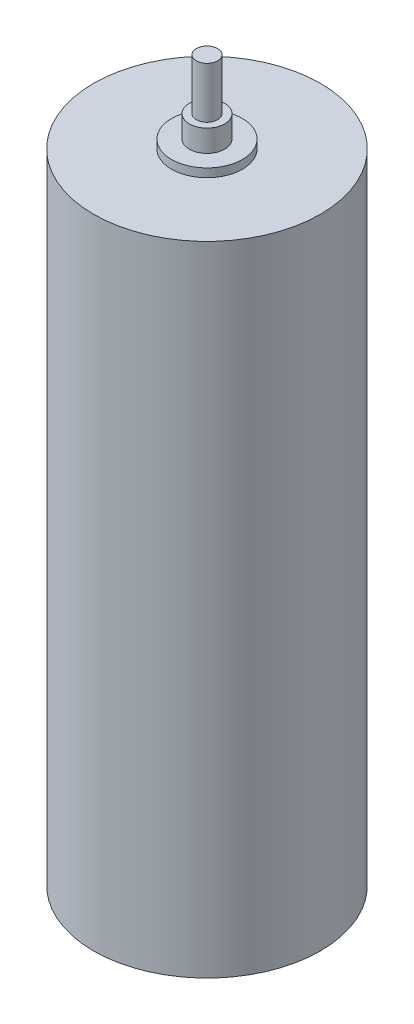
ISO-10303-21;
HEADER;
FILE_DESCRIPTION(('STEP AP214'),'2;1');
FILE_NAME('part.step','',(''),(''),'','','');
FILE_SCHEMA(('AUTOMOTIVE_DESIGN { 1 0 10303 214 1 1 1 1 }'));
ENDSEC;
DATA;
#1=APPLICATION_CONTEXT('core data for automotive mechanical design processes');
#2=APPLICATION_PROTOCOL_DEFINITION('international standard','automotive_design',2000,#1);
#3=PRODUCT_CONTEXT('',#1,'mechanical');
#4=PRODUCT('Part','Part','',(#3));
#5=PRODUCT_RELATED_PRODUCT_CATEGORY('part','',(#4));
#6=PRODUCT_DEFINITION_FORMATION('','',#4);
#7=PRODUCT_DEFINITION_CONTEXT('part definition',#1,'design');
#8=PRODUCT_DEFINITION('design','',#6,#7);
#9=PRODUCT_DEFINITION_SHAPE('','',#8);
#10=(LENGTH_UNIT() NAMED_UNIT(*) SI_UNIT(.MILLI.,.METRE.));
#11=(NAMED_UNIT(*) PLANE_ANGLE_UNIT() SI_UNIT($,.RADIAN.));
#12=(NAMED_UNIT(*) SI_UNIT($,.STERADIAN.) SOLID_ANGLE_UNIT());
#13=UNCERTAINTY_MEASURE_WITH_UNIT(LENGTH_MEASURE(1.E-05),#10,'distance_accuracy_value','');
#14=(GEOMETRIC_REPRESENTATION_CONTEXT(3) GLOBAL_UNCERTAINTY_ASSIGNED_CONTEXT((#13)) GLOBAL_UNIT_ASSIGNED_CONTEXT((#10,
#11,#12)) REPRESENTATION_CONTEXT('',''));
#15=CARTESIAN_POINT('',(0.,0.,0.));
#16=DIRECTION('',(0.,0.,1.));
#17=DIRECTION('',(1.,0.,0.));
#18=AXIS2_PLACEMENT_3D('',#15,#16,#17);
#19=CARTESIAN_POINT('',(0.,-45.,0.));
#20=DIRECTION('',(0.,1.,0.));
#21=DIRECTION('',(0.,0.,1.));
#22=AXIS2_PLACEMENT_3D('',#19,#20,#21);
#23=CYLINDRICAL_SURFACE('',#22,8.);
#24=CARTESIAN_POINT('',(0.,-45.,0.));
#25=DIRECTION('',(0.,1.,0.));
#26=DIRECTION('',(0.,0.,1.));
#27=AXIS2_PLACEMENT_3D('',#24,#25,#26);
#28=CIRCLE('',#27,8.);
#29=CARTESIAN_POINT('',(0.,-45.,8.));
#30=VERTEX_POINT('',#29);
#31=EDGE_CURVE('E41',#30,#30,#28,.T.);
#32=CARTESIAN_POINT('',(0.,0.,0.));
#33=DIRECTION('',(0.,1.,0.));
#34=DIRECTION('',(0.,0.,1.));
#35=AXIS2_PLACEMENT_3D('',#32,#33,#34);
#36=CIRCLE('',#35,8.);
#37=CARTESIAN_POINT('',(0.,0.,8.));
#38=VERTEX_POINT('',#37);
#39=EDGE_CURVE('E46',#38,#38,#36,.T.);
#40=CARTESIAN_POINT('',(0.,-45.,8.));
#41=CARTESIAN_POINT('',(0.,-44.53125,8.));
#42=CARTESIAN_POINT('',(0.,-44.0625,8.));
#43=CARTESIAN_POINT('',(0.,-43.125,8.));
#44=CARTESIAN_POINT('',(0.,-42.65625,8.));
#45=CARTESIAN_POINT('',(0.,-41.71875,8.));
#46=CARTESIAN_POINT('',(0.,-41.25,8.));
#47=CARTESIAN_POINT('',(0.,-40.3125,8.));
#48=CARTESIAN_POINT('',(0.,-39.84375,8.));
#49=CARTESIAN_POINT('',(0.,-38.90625,8.));
#50=CARTESIAN_POINT('',(0.,-38.4375,8.));
#51=CARTESIAN_POINT('',(0.,-37.5,8.));
#52=CARTESIAN_POINT('',(0.,-37.03125,8.));
#53=CARTESIAN_POINT('',(0.,-36.09375,8.));
#54=CARTESIAN_POINT('',(0.,-35.625,8.));
#55=CARTESIAN_POINT('',(0.,-34.6875,8.));
#56=CARTESIAN_POINT('',(0.,-34.21875,8.));
#57=CARTESIAN_POINT('',(0.,-33.28125,8.));
#58=CARTESIAN_POINT('',(0.,-32.8125,8.));
#59=CARTESIAN_POINT('',(0.,-31.875,8.));
#60=CARTESIAN_POINT('',(0.,-31.40625,8.));
#61=CARTESIAN_POINT('',(0.,-30.46875,8.));
#62=CARTESIAN_POINT('',(0.,-30.,8.));
#63=CARTESIAN_POINT('',(0.,-29.0625,8.));
#64=CARTESIAN_POINT('',(0.,-28.59375,8.));
#65=CARTESIAN_POINT('',(0.,-27.65625,8.));
#66=CARTESIAN_POINT('',(0.,-27.1875,8.));
#67=CARTESIAN_POINT('',(0.,-26.25,8.));
#68=CARTESIAN_POINT('',(0.,-25.78125,8.));
#69=CARTESIAN_POINT('',(0.,-24.84375,8.));
#70=CARTESIAN_POINT('',(0.,-24.375,8.));
#71=CARTESIAN_POINT('',(0.,-23.4375,8.));
#72=CARTESIAN_POINT('',(0.,-22.96875,8.));
#73=CARTESIAN_POINT('',(0.,-22.03125,8.));
#74=CARTESIAN_POINT('',(0.,-21.5625,8.));
#75=CARTESIAN_POINT('',(0.,-20.625,8.));
#76=CARTESIAN_POINT('',(0.,-20.15625,8.));
#77=CARTESIAN_POINT('',(0.,-19.21875,8.));
#78=CARTESIAN_POINT('',(0.,-18.75,8.));
#79=CARTESIAN_POINT('',(0.,-17.8125,8.));
#80=CARTESIAN_POINT('',(0.,-17.34375,8.));
#81=CARTESIAN_POINT('',(0.,-16.40625,8.));
#82=CARTESIAN_POINT('',(0.,-15.9375,8.));
#83=CARTESIAN_POINT('',(0.,-15.,8.));
#84=CARTESIAN_POINT('',(0.,-14.53125,8.));
#85=CARTESIAN_POINT('',(0.,-13.59375,8.));
#86=CARTESIAN_POINT('',(0.,-13.125,8.));
#87=CARTESIAN_POINT('',(0.,-12.1875,8.));
#88=CARTESIAN_POINT('',(0.,-11.71875,8.));
#89=CARTESIAN_POINT('',(0.,-10.78125,8.));
#90=CARTESIAN_POINT('',(0.,-10.3125,8.));
#91=CARTESIAN_POINT('',(0.,-9.37500000000001,8.));
#92=CARTESIAN_POINT('',(0.,-8.90625000000001,8.));
#93=CARTESIAN_POINT('',(0.,-7.96875000000001,8.));
#94=CARTESIAN_POINT('',(0.,-7.50000000000001,8.));
#95=CARTESIAN_POINT('',(0.,-6.56250000000001,8.));
#96=CARTESIAN_POINT('',(0.,-6.09375000000001,8.));
#97=CARTESIAN_POINT('',(0.,-5.15625000000001,8.));
#98=CARTESIAN_POINT('',(0.,-4.68750000000001,8.));
#99=CARTESIAN_POINT('',(0.,-3.75000000000001,8.));
#100=CARTESIAN_POINT('',(0.,-3.28125000000001,8.));
#101=CARTESIAN_POINT('',(0.,-2.34375000000001,8.));
#102=CARTESIAN_POINT('',(0.,-1.87500000000001,8.));
#103=CARTESIAN_POINT('',(0.,-0.937500000000006,8.));
#104=CARTESIAN_POINT('',(0.,-0.468750000000007,8.));
#105=CARTESIAN_POINT('',(0.,0.,8.));
#106=B_SPLINE_CURVE_WITH_KNOTS('',3,(#40,#41,#42,#43,#44,#45,#46,#47,#48,#49,#50,#51,#52,#53,
#54,#55,#56,#57,#58,#59,#60,#61,#62,#63,#64,#65,#66,#67,#68,#69,#70,#71,#72,#73,#74,#75,#76,#77,
#78,#79,#80,#81,#82,#83,#84,#85,#86,#87,#88,#89,#90,#91,#92,#93,#94,#95,#96,#97,#98,#99,#100,
#101,#102,#103,#104,#105),.UNSPECIFIED.,.F.,.F.,(4,2,2,2,2,2,2,2,2,2,2,2,2,2,2,2,2,2,2,2,2,2,2,
2,2,2,2,2,2,2,2,2,4),(0.,1.40625,2.8125,4.21874999999999,5.625,7.03125,8.43749999999999,9.84375,
11.25,12.65625,14.0625,15.46875,16.875,18.28125,19.6875,21.09375,22.5,23.90625,25.3125,26.71875,
28.125,29.53125,30.9375,32.34375,33.75,35.15625,36.5625,37.96875,39.375,40.78125,42.1875,
43.59375,45.),.UNSPECIFIED.);
#107=EDGE_CURVE('BSEAM34',#30,#38,#106,.T.);
#108=ORIENTED_EDGE('',*,*,#31,.T.);
#109=ORIENTED_EDGE('',*,*,#39,.F.);
#110=ORIENTED_EDGE('',*,*,#107,.T.);
#111=ORIENTED_EDGE('',*,*,#107,.F.);
#112=EDGE_LOOP('',(#108,#110,#109,#111));
#113=FACE_BOUND('',#112,.T.);
#114=ADVANCED_FACE('F34',(#113),#23,.T.);
#115=CARTESIAN_POINT('',(0.,-45.,0.));
#116=DIRECTION('',(0.,1.,0.));
#117=DIRECTION('',(0.,0.,1.));
#118=AXIS2_PLACEMENT_3D('',#115,#116,#117);
#119=PLANE('',#118);
#120=ORIENTED_EDGE('',*,*,#31,.F.);
#121=EDGE_LOOP('',(#120));
#122=FACE_BOUND('',#121,.T.);
#123=ADVANCED_FACE('F83',(#122),#119,.F.);
#124=CARTESIAN_POINT('',(0.,0.,0.));
#125=DIRECTION('',(0.,1.,0.));
#126=DIRECTION('',(0.,0.,1.));
#127=AXIS2_PLACEMENT_3D('',#124,#125,#126);
#128=PLANE('',#127);
#129=CARTESIAN_POINT('',(0.,0.,0.));
#130=DIRECTION('',(0.,1.,0.));
#131=DIRECTION('',(0.,0.,1.));
#132=AXIS2_PLACEMENT_3D('',#129,#130,#131);
#133=CIRCLE('',#132,2.5);
#134=CARTESIAN_POINT('',(0.,0.,2.5));
#135=VERTEX_POINT('',#134);
#136=EDGE_CURVE('E10',#135,#135,#133,.T.);
#137=ORIENTED_EDGE('',*,*,#136,.F.);
#138=EDGE_LOOP('',(#137));
#139=FACE_BOUND('',#138,.T.);
#140=ORIENTED_EDGE('',*,*,#39,.T.);
#141=EDGE_LOOP('',(#140));
#142=FACE_BOUND('',#141,.T.);
#143=ADVANCED_FACE('F74',(#139,#142),#128,.T.);
#144=CARTESIAN_POINT('',(0.,0.6,0.));
#145=DIRECTION('',(0.,-1.,0.));
#146=DIRECTION('',(0.,0.,-1.));
#147=AXIS2_PLACEMENT_3D('',#144,#145,#146);
#148=CYLINDRICAL_SURFACE('',#147,2.5);
#149=CARTESIAN_POINT('',(0.,0.6,0.));
#150=DIRECTION('',(0.,1.,0.));
#151=DIRECTION('',(0.,0.,1.));
#152=AXIS2_PLACEMENT_3D('',#149,#150,#151);
#153=CIRCLE('',#152,2.5);
#154=CARTESIAN_POINT('',(0.,0.6,2.5));
#155=VERTEX_POINT('',#154);
#156=EDGE_CURVE('E49',#155,#155,#153,.T.);
#157=ORIENTED_EDGE('',*,*,#156,.F.);
#158=EDGE_LOOP('',(#157));
#159=FACE_BOUND('',#158,.T.);
#160=ORIENTED_EDGE('',*,*,#136,.T.);
#161=EDGE_LOOP('',(#160));
#162=FACE_BOUND('',#161,.T.);
#163=ADVANCED_FACE('F72',(#159,#162),#148,.T.);
#164=CARTESIAN_POINT('',(0.,0.6,0.));
#165=DIRECTION('',(0.,1.,0.));
#166=DIRECTION('',(0.,0.,1.));
#167=AXIS2_PLACEMENT_3D('',#164,#165,#166);
#168=PLANE('',#167);
#169=CARTESIAN_POINT('',(0.,0.6,0.));
#170=DIRECTION('',(0.,1.,0.));
#171=DIRECTION('',(0.,0.,1.));
#172=AXIS2_PLACEMENT_3D('',#169,#170,#171);
#173=CIRCLE('',#172,1.25);
#174=CARTESIAN_POINT('',(0.,0.6,-1.25));
#175=VERTEX_POINT('',#174);
#176=EDGE_CURVE('E37',#175,#175,#173,.F.);
#177=ORIENTED_EDGE('',*,*,#176,.T.);
#178=EDGE_LOOP('',(#177));
#179=FACE_BOUND('',#178,.T.);
#180=ORIENTED_EDGE('',*,*,#156,.T.);
#181=EDGE_LOOP('',(#180));
#182=FACE_BOUND('',#181,.T.);
#183=ADVANCED_FACE('F70',(#179,#182),#168,.T.);
#184=CARTESIAN_POINT('',(0.,2.15,0.));
#185=DIRECTION('',(0.,-1.,0.));
#186=DIRECTION('',(0.,0.,-1.));
#187=AXIS2_PLACEMENT_3D('',#184,#185,#186);
#188=CYLINDRICAL_SURFACE('',#187,1.25);
#189=CARTESIAN_POINT('',(0.,2.15,0.));
#190=DIRECTION('',(0.,1.,0.));
#191=DIRECTION('',(0.,0.,1.));
#192=AXIS2_PLACEMENT_3D('',#189,#190,#191);
#193=CIRCLE('',#192,1.25);
#194=CARTESIAN_POINT('',(0.,2.15,-1.25));
#195=VERTEX_POINT('',#194);
#196=EDGE_CURVE('E55',#195,#195,#193,.T.);
#197=CARTESIAN_POINT('',(0.,0.6,-1.25));
#198=CARTESIAN_POINT('',(0.,0.616145833333333,-1.25));
#199=CARTESIAN_POINT('',(0.,0.632291666666666,-1.25));
#200=CARTESIAN_POINT('',(0.,0.664583333333333,-1.25));
#201=CARTESIAN_POINT('',(0.,0.680729166666666,-1.25));
#202=CARTESIAN_POINT('',(0.,0.713020833333333,-1.25));
#203=CARTESIAN_POINT('',(0.,0.729166666666666,-1.25));
#204=CARTESIAN_POINT('',(0.,0.761458333333333,-1.25));
#205=CARTESIAN_POINT('',(0.,0.777604166666666,-1.25));
#206=CARTESIAN_POINT('',(0.,0.809895833333333,-1.25));
#207=CARTESIAN_POINT('',(0.,0.826041666666666,-1.25));
#208=CARTESIAN_POINT('',(0.,0.858333333333333,-1.25));
#209=CARTESIAN_POINT('',(0.,0.874479166666666,-1.25));
#210=CARTESIAN_POINT('',(0.,0.906770833333333,-1.25));
#211=CARTESIAN_POINT('',(0.,0.922916666666666,-1.25));
#212=CARTESIAN_POINT('',(0.,0.955208333333333,-1.25));
#213=CARTESIAN_POINT('',(0.,0.971354166666666,-1.25));
#214=CARTESIAN_POINT('',(0.,1.00364583333333,-1.25));
#215=CARTESIAN_POINT('',(0.,1.01979166666667,-1.25));
#216=CARTESIAN_POINT('',(0.,1.05208333333333,-1.25));
#217=CARTESIAN_POINT('',(0.,1.06822916666667,-1.25));
#218=CARTESIAN_POINT('',(0.,1.10052083333333,-1.25));
#219=CARTESIAN_POINT('',(0.,1.11666666666667,-1.25));
#220=CARTESIAN_POINT('',(0.,1.14895833333333,-1.25));
#221=CARTESIAN_POINT('',(0.,1.16510416666667,-1.25));
#222=CARTESIAN_POINT('',(0.,1.19739583333333,-1.25));
#223=CARTESIAN_POINT('',(0.,1.21354166666667,-1.25));
#224=CARTESIAN_POINT('',(0.,1.24583333333333,-1.25));
#225=CARTESIAN_POINT('',(0.,1.26197916666667,-1.25));
#226=CARTESIAN_POINT('',(0.,1.29427083333333,-1.25));
#227=CARTESIAN_POINT('',(0.,1.31041666666667,-1.25));
#228=CARTESIAN_POINT('',(0.,1.34270833333333,-1.25));
#229=CARTESIAN_POINT('',(0.,1.35885416666667,-1.25));
#230=CARTESIAN_POINT('',(0.,1.39114583333333,-1.25));
#231=CARTESIAN_POINT('',(0.,1.40729166666667,-1.25));
#232=CARTESIAN_POINT('',(0.,1.43958333333333,-1.25));
#233=CARTESIAN_POINT('',(0.,1.45572916666667,-1.25));
#234=CARTESIAN_POINT('',(0.,1.48802083333333,-1.25));
#235=CARTESIAN_POINT('',(0.,1.50416666666667,-1.25));
#236=CARTESIAN_POINT('',(0.,1.53645833333333,-1.25));
#237=CARTESIAN_POINT('',(0.,1.55260416666667,-1.25));
#238=CARTESIAN_POINT('',(0.,1.58489583333333,-1.25));
#239=CARTESIAN_POINT('',(0.,1.60104166666667,-1.25));
#240=CARTESIAN_POINT('',(0.,1.63333333333333,-1.25));
#241=CARTESIAN_POINT('',(0.,1.64947916666667,-1.25));
#242=CARTESIAN_POINT('',(0.,1.68177083333333,-1.25));
#243=CARTESIAN_POINT('',(0.,1.69791666666667,-1.25));
#244=CARTESIAN_POINT('',(0.,1.73020833333333,-1.25));
#245=CARTESIAN_POINT('',(0.,1.74635416666667,-1.25));
#246=CARTESIAN_POINT('',(0.,1.77864583333333,-1.25));
#247=CARTESIAN_POINT('',(0.,1.79479166666667,-1.25));
#248=CARTESIAN_POINT('',(0.,1.82708333333333,-1.25));
#249=CARTESIAN_POINT('',(0.,1.84322916666667,-1.25));
#250=CARTESIAN_POINT('',(0.,1.87552083333333,-1.25));
#251=CARTESIAN_POINT('',(0.,1.89166666666667,-1.25));
#252=CARTESIAN_POINT('',(0.,1.92395833333333,-1.25));
#253=CARTESIAN_POINT('',(0.,1.94010416666667,-1.25));
#254=CARTESIAN_POINT('',(0.,1.97239583333333,-1.25));
#255=CARTESIAN_POINT('',(0.,1.98854166666667,-1.25));
#256=CARTESIAN_POINT('',(0.,2.02083333333333,-1.25));
#257=CARTESIAN_POINT('',(0.,2.03697916666667,-1.25));
#258=CARTESIAN_POINT('',(0.,2.06927083333333,-1.25));
#259=CARTESIAN_POINT('',(0.,2.08541666666667,-1.25));
#260=CARTESIAN_POINT('',(0.,2.11770833333333,-1.25));
#261=CARTESIAN_POINT('',(0.,2.13385416666667,-1.25));
#262=CARTESIAN_POINT('',(0.,2.15,-1.25));
#263=B_SPLINE_CURVE_WITH_KNOTS('',3,(#197,#198,#199,#200,#201,#202,#203,#204,#205,#206,#207,
#208,#209,#210,#211,#212,#213,#214,#215,#216,#217,#218,#219,#220,#221,#222,#223,#224,#225,#226,
#227,#228,#229,#230,#231,#232,#233,#234,#235,#236,#237,#238,#239,#240,#241,#242,#243,#244,#245,
#246,#247,#248,#249,#250,#251,#252,#253,#254,#255,#256,#257,#258,#259,#260,#261,#262),
.UNSPECIFIED.,.F.,.F.,(4,2,2,2,2,2,2,2,2,2,2,2,2,2,2,2,2,2,2,2,2,2,2,2,2,2,2,2,2,2,2,2,4),(0.,
0.0484375000000001,0.096875,0.1453125,0.19375,0.2421875,0.290625,0.3390625,0.3875,0.4359375,
0.484375,0.5328125,0.58125,0.6296875,0.678125,0.7265625,0.775,0.8234375,0.871875,0.9203125,
0.96875,1.0171875,1.065625,1.1140625,1.1625,1.2109375,1.259375,1.3078125,1.35625,1.4046875,
1.453125,1.5015625,1.55),.UNSPECIFIED.);
#264=EDGE_CURVE('BSEAM80',#175,#195,#263,.T.);
#265=ORIENTED_EDGE('',*,*,#176,.F.);
#266=ORIENTED_EDGE('',*,*,#196,.F.);
#267=ORIENTED_EDGE('',*,*,#264,.T.);
#268=ORIENTED_EDGE('',*,*,#264,.F.);
#269=EDGE_LOOP('',(#265,#267,#266,#268));
#270=FACE_BOUND('',#269,.T.);
#271=ADVANCED_FACE('F80',(#270),#188,.T.);
#272=CARTESIAN_POINT('',(0.,2.15,0.));
#273=DIRECTION('',(0.,1.,0.));
#274=DIRECTION('',(0.,0.,1.));
#275=AXIS2_PLACEMENT_3D('',#272,#273,#274);
#276=PLANE('',#275);
#277=CARTESIAN_POINT('',(0.,2.15,0.));
#278=DIRECTION('',(0.,1.,0.));
#279=DIRECTION('',(0.,0.,1.));
#280=AXIS2_PLACEMENT_3D('',#277,#278,#279);
#281=CIRCLE('',#280,0.75);
#282=CARTESIAN_POINT('',(0.,2.15,0.75));
#283=VERTEX_POINT('',#282);
#284=EDGE_CURVE('E53',#283,#283,#281,.T.);
#285=ORIENTED_EDGE('',*,*,#284,.F.);
#286=EDGE_LOOP('',(#285));
#287=FACE_BOUND('',#286,.T.);
#288=ORIENTED_EDGE('',*,*,#196,.T.);
#289=EDGE_LOOP('',(#288));
#290=FACE_BOUND('',#289,.T.);
#291=ADVANCED_FACE('F120',(#287,#290),#276,.T.);
#292=CARTESIAN_POINT('',(0.,5.75,0.));
#293=DIRECTION('',(0.,1.,0.));
#294=DIRECTION('',(0.,0.,1.));
#295=AXIS2_PLACEMENT_3D('',#292,#293,#294);
#296=PLANE('',#295);
#297=CARTESIAN_POINT('',(0.,5.75,0.));
#298=DIRECTION('',(0.,1.,0.));
#299=DIRECTION('',(0.,0.,1.));
#300=AXIS2_PLACEMENT_3D('',#297,#298,#299);
#301=CIRCLE('',#300,0.75);
#302=CARTESIAN_POINT('',(0.,5.75,0.75));
#303=VERTEX_POINT('',#302);
#304=EDGE_CURVE('E59',#303,#303,#301,.T.);
#305=ORIENTED_EDGE('',*,*,#304,.T.);
#306=EDGE_LOOP('',(#305));
#307=FACE_BOUND('',#306,.T.);
#308=ADVANCED_FACE('F138',(#307),#296,.T.);
#309=CARTESIAN_POINT('',(0.,5.75,0.));
#310=DIRECTION('',(0.,-1.,0.));
#311=DIRECTION('',(0.,0.,-1.));
#312=AXIS2_PLACEMENT_3D('',#309,#310,#311);
#313=CYLINDRICAL_SURFACE('',#312,0.75);
#314=ORIENTED_EDGE('',*,*,#284,.T.);
#315=EDGE_LOOP('',(#314));
#316=FACE_BOUND('',#315,.T.);
#317=ORIENTED_EDGE('',*,*,#304,.F.);
#318=EDGE_LOOP('',(#317));
#319=FACE_BOUND('',#318,.T.);
#320=ADVANCED_FACE('F134',(#316,#319),#313,.T.);
#321=CLOSED_SHELL('',(#114,#123,#143,#163,#183,#271,#291,#308,#320));
#322=MANIFOLD_SOLID_BREP('B2',#321);
#323=ADVANCED_BREP_SHAPE_REPRESENTATION('',(#18,#322),#14);
#324=SHAPE_DEFINITION_REPRESENTATION(#9,#323);
ENDSEC;
END-ISO-10303-21;
